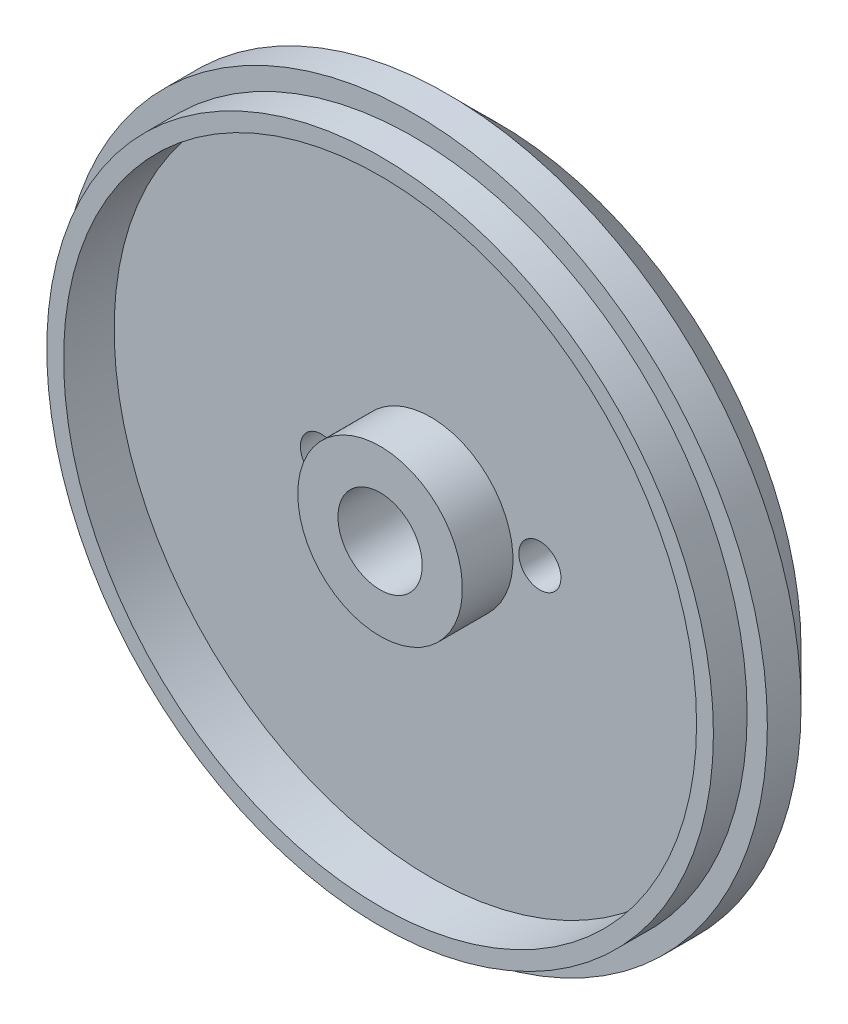
ISO-10303-21;
HEADER;
FILE_DESCRIPTION(('STEP AP214'),'2;1');
FILE_NAME('part.step','',(''),(''),'','','');
FILE_SCHEMA(('AUTOMOTIVE_DESIGN { 1 0 10303 214 1 1 1 1 }'));
ENDSEC;
DATA;
#1=APPLICATION_CONTEXT('core data for automotive mechanical design processes');
#2=APPLICATION_PROTOCOL_DEFINITION('international standard','automotive_design',2000,#1);
#3=PRODUCT_CONTEXT('',#1,'mechanical');
#4=PRODUCT('Part','Part','',(#3));
#5=PRODUCT_RELATED_PRODUCT_CATEGORY('part','',(#4));
#6=PRODUCT_DEFINITION_FORMATION('','',#4);
#7=PRODUCT_DEFINITION_CONTEXT('part definition',#1,'design');
#8=PRODUCT_DEFINITION('design','',#6,#7);
#9=PRODUCT_DEFINITION_SHAPE('','',#8);
#10=(LENGTH_UNIT() NAMED_UNIT(*) SI_UNIT(.MILLI.,.METRE.));
#11=(NAMED_UNIT(*) PLANE_ANGLE_UNIT() SI_UNIT($,.RADIAN.));
#12=(NAMED_UNIT(*) SI_UNIT($,.STERADIAN.) SOLID_ANGLE_UNIT());
#13=UNCERTAINTY_MEASURE_WITH_UNIT(LENGTH_MEASURE(1.E-05),#10,'distance_accuracy_value','');
#14=(GEOMETRIC_REPRESENTATION_CONTEXT(3) GLOBAL_UNCERTAINTY_ASSIGNED_CONTEXT((#13)) GLOBAL_UNIT_ASSIGNED_CONTEXT((#10,
#11,#12)) REPRESENTATION_CONTEXT('',''));
#15=CARTESIAN_POINT('',(0.,0.,0.));
#16=DIRECTION('',(0.,0.,1.));
#17=DIRECTION('',(1.,0.,0.));
#18=AXIS2_PLACEMENT_3D('',#15,#16,#17);
#19=CARTESIAN_POINT('',(19.78,0.,-38.5135189018775));
#20=DIRECTION('',(0.,0.,1.));
#21=DIRECTION('',(1.,0.,0.));
#22=AXIS2_PLACEMENT_3D('',#19,#20,#21);
#23=PLANE('',#22);
#24=CARTESIAN_POINT('',(-1.3443984758073E-13,0.,-38.5135189018774));
#25=DIRECTION('',(0.,0.,1.));
#26=DIRECTION('',(1.,0.,0.));
#27=AXIS2_PLACEMENT_3D('',#24,#25,#26);
#28=CIRCLE('',#27,19.7800000000001);
#29=CARTESIAN_POINT('',(19.78,0.,-38.5135189018775));
#30=VERTEX_POINT('',#29);
#31=EDGE_CURVE('E60',#30,#30,#28,.T.);
#32=ORIENTED_EDGE('',*,*,#31,.F.);
#33=EDGE_LOOP('',(#32));
#34=FACE_BOUND('',#33,.T.);
#35=CARTESIAN_POINT('',(-1.3443984758073E-13,0.,-38.5135189018774));
#36=DIRECTION('',(0.,0.,1.));
#37=DIRECTION('',(1.,0.,0.));
#38=AXIS2_PLACEMENT_3D('',#35,#36,#37);
#39=CIRCLE('',#38,20.9799999999991);
#40=CARTESIAN_POINT('',(20.979999999999,0.,-38.5135189018775));
#41=VERTEX_POINT('',#40);
#42=EDGE_CURVE('E18',#41,#41,#39,.F.);
#43=ORIENTED_EDGE('',*,*,#42,.F.);
#44=EDGE_LOOP('',(#43));
#45=FACE_BOUND('',#44,.T.);
#46=ADVANCED_FACE('F15',(#34,#45),#23,.T.);
#47=CARTESIAN_POINT('',(0.,0.,0.));
#48=DIRECTION('',(0.,0.,1.));
#49=DIRECTION('',(1.,0.,0.));
#50=AXIS2_PLACEMENT_3D('',#47,#48,#49);
#51=CYLINDRICAL_SURFACE('',#50,20.9799999999991);
#52=ORIENTED_EDGE('',*,*,#42,.T.);
#53=EDGE_LOOP('',(#52));
#54=FACE_BOUND('',#53,.T.);
#55=CARTESIAN_POINT('',(-1.41421284302898E-13,0.,-40.5135189018775));
#56=DIRECTION('',(0.,0.,1.));
#57=DIRECTION('',(1.,0.,0.));
#58=AXIS2_PLACEMENT_3D('',#55,#56,#57);
#59=CIRCLE('',#58,20.9799999999991);
#60=CARTESIAN_POINT('',(20.979999999999,0.,-40.5135189018775));
#61=VERTEX_POINT('',#60);
#62=EDGE_CURVE('E30',#61,#61,#59,.F.);
#63=ORIENTED_EDGE('',*,*,#62,.F.);
#64=EDGE_LOOP('',(#63));
#65=FACE_BOUND('',#64,.T.);
#66=ADVANCED_FACE('F68',(#54,#65),#51,.T.);
#67=CARTESIAN_POINT('',(0.,0.,0.));
#68=DIRECTION('',(0.,0.,1.));
#69=DIRECTION('',(1.,0.,0.));
#70=AXIS2_PLACEMENT_3D('',#67,#68,#69);
#71=CYLINDRICAL_SURFACE('',#70,19.7800000000001);
#72=ORIENTED_EDGE('',*,*,#31,.T.);
#73=EDGE_LOOP('',(#72));
#74=FACE_BOUND('',#73,.T.);
#75=CARTESIAN_POINT('',(-1.27458410858563E-13,0.,-36.5135189018774));
#76=DIRECTION('',(0.,0.,1.));
#77=DIRECTION('',(1.,0.,0.));
#78=AXIS2_PLACEMENT_3D('',#75,#76,#77);
#79=CIRCLE('',#78,19.7800000000001);
#80=CARTESIAN_POINT('',(19.78,0.,-36.5135189018774));
#81=VERTEX_POINT('',#80);
#82=EDGE_CURVE('E58',#81,#81,#79,.T.);
#83=ORIENTED_EDGE('',*,*,#82,.F.);
#84=EDGE_LOOP('',(#83));
#85=FACE_BOUND('',#84,.T.);
#86=ADVANCED_FACE('F77',(#74,#85),#71,.T.);
#87=CARTESIAN_POINT('',(-1.42247325030098E-13,0.,-40.5135189018775));
#88=DIRECTION('',(0.,0.,1.));
#89=DIRECTION('',(1.,0.,0.));
#90=AXIS2_PLACEMENT_3D('',#87,#88,#89);
#91=CONICAL_SURFACE('',#90,20.9799999999991,0.785398163397446);
#92=ORIENTED_EDGE('',*,*,#62,.T.);
#93=EDGE_LOOP('',(#92));
#94=FACE_BOUND('',#93,.T.);
#95=CARTESIAN_POINT('',(-1.52665588041208E-13,0.,-43.5135189018775));
#96=DIRECTION('',(0.,0.,1.));
#97=DIRECTION('',(1.,0.,0.));
#98=AXIS2_PLACEMENT_3D('',#95,#96,#97);
#99=CIRCLE('',#98,17.9799999999991);
#100=CARTESIAN_POINT('',(17.979999999999,0.,-43.5135189018775));
#101=VERTEX_POINT('',#100);
#102=EDGE_CURVE('E55',#101,#101,#99,.F.);
#103=ORIENTED_EDGE('',*,*,#102,.F.);
#104=EDGE_LOOP('',(#103));
#105=FACE_BOUND('',#104,.T.);
#106=ADVANCED_FACE('F117',(#94,#105),#91,.T.);
#107=CARTESIAN_POINT('',(-2.21328687789345E-13,0.,-63.4049112230954));
#108=DIRECTION('',(0.,0.,1.));
#109=DIRECTION('',(1.,0.,0.));
#110=AXIS2_PLACEMENT_3D('',#107,#108,#109);
#111=CYLINDRICAL_SURFACE('',#110,2.50000000000027);
#112=CARTESIAN_POINT('',(-1.27458410858563E-13,0.,-36.5135189018775));
#113=DIRECTION('',(0.,0.,1.));
#114=DIRECTION('',(1.,0.,0.));
#115=AXIS2_PLACEMENT_3D('',#112,#113,#114);
#116=CIRCLE('',#115,2.50000000000027);
#117=CARTESIAN_POINT('',(2.50000000000014,0.,-36.5135189018775));
#118=VERTEX_POINT('',#117);
#119=EDGE_CURVE('E49',#118,#118,#116,.F.);
#120=ORIENTED_EDGE('',*,*,#119,.F.);
#121=EDGE_LOOP('',(#120));
#122=FACE_BOUND('',#121,.T.);
#123=CARTESIAN_POINT('',(-1.51893439386149E-13,0.,-43.5135189018775));
#124=DIRECTION('',(0.,0.,1.));
#125=DIRECTION('',(1.,0.,0.));
#126=AXIS2_PLACEMENT_3D('',#123,#124,#125);
#127=CIRCLE('',#126,2.50000000000027);
#128=CARTESIAN_POINT('',(2.50000000000012,0.,-43.5135189018775));
#129=VERTEX_POINT('',#128);
#130=EDGE_CURVE('E52',#129,#129,#127,.T.);
#131=ORIENTED_EDGE('',*,*,#130,.F.);
#132=EDGE_LOOP('',(#131));
#133=FACE_BOUND('',#132,.T.);
#134=ADVANCED_FACE('F113',(#122,#133),#111,.F.);
#135=CARTESIAN_POINT('',(-1.16986255775312E-13,0.,-36.5135189018774));
#136=DIRECTION('',(0.,0.,1.));
#137=DIRECTION('',(1.,0.,0.));
#138=AXIS2_PLACEMENT_3D('',#135,#136,#137);
#139=PLANE('',#138);
#140=ORIENTED_EDGE('',*,*,#82,.T.);
#141=EDGE_LOOP('',(#140));
#142=FACE_BOUND('',#141,.T.);
#143=CARTESIAN_POINT('',(-1.27458410858563E-13,0.,-36.5135189018774));
#144=DIRECTION('',(0.,0.,1.));
#145=DIRECTION('',(1.,0.,0.));
#146=AXIS2_PLACEMENT_3D('',#143,#144,#145);
#147=CIRCLE('',#146,18.7800000000002);
#148=CARTESIAN_POINT('',(18.78,0.,-36.5135189018774));
#149=VERTEX_POINT('',#148);
#150=EDGE_CURVE('E46',#149,#149,#147,.F.);
#151=ORIENTED_EDGE('',*,*,#150,.T.);
#152=EDGE_LOOP('',(#151));
#153=FACE_BOUND('',#152,.T.);
#154=ADVANCED_FACE('F109',(#142,#153),#139,.T.);
#155=CARTESIAN_POINT('',(2.5000000000001,0.,-43.5135189018775));
#156=DIRECTION('',(0.,0.,-1.));
#157=DIRECTION('',(-1.,0.,0.));
#158=AXIS2_PLACEMENT_3D('',#155,#156,#157);
#159=PLANE('',#158);
#160=ORIENTED_EDGE('',*,*,#130,.T.);
#161=EDGE_LOOP('',(#160));
#162=FACE_BOUND('',#161,.T.);
#163=CARTESIAN_POINT('',(-6.48182468167782,-0.485745608311755,-43.5135189018775));
#164=DIRECTION('',(0.,0.,-1.));
#165=DIRECTION('',(-1.,0.,0.));
#166=AXIS2_PLACEMENT_3D('',#163,#164,#165);
#167=CIRCLE('',#166,1.24999999999999);
#168=CARTESIAN_POINT('',(-7.73182468167782,-0.485745608311755,-43.5135189018775));
#169=VERTEX_POINT('',#168);
#170=EDGE_CURVE('E43',#169,#169,#167,.F.);
#171=ORIENTED_EDGE('',*,*,#170,.T.);
#172=EDGE_LOOP('',(#171));
#173=FACE_BOUND('',#172,.T.);
#174=CARTESIAN_POINT('',(6.48182468167752,0.485745608311708,-43.5135189018775));
#175=DIRECTION('',(0.,0.,-1.));
#176=DIRECTION('',(-1.,0.,0.));
#177=AXIS2_PLACEMENT_3D('',#174,#175,#176);
#178=CIRCLE('',#177,1.24999999999999);
#179=CARTESIAN_POINT('',(5.23182468167753,0.485745608311708,-43.5135189018775));
#180=VERTEX_POINT('',#179);
#181=EDGE_CURVE('E40',#180,#180,#178,.F.);
#182=ORIENTED_EDGE('',*,*,#181,.T.);
#183=EDGE_LOOP('',(#182));
#184=FACE_BOUND('',#183,.T.);
#185=ORIENTED_EDGE('',*,*,#102,.T.);
#186=EDGE_LOOP('',(#185));
#187=FACE_BOUND('',#186,.T.);
#188=ADVANCED_FACE('F105',(#162,#173,#184,#187),#159,.T.);
#189=CARTESIAN_POINT('',(2.5000000000001,0.,-36.5135189018775));
#190=DIRECTION('',(0.,0.,1.));
#191=DIRECTION('',(1.,0.,0.));
#192=AXIS2_PLACEMENT_3D('',#189,#190,#191);
#193=PLANE('',#192);
#194=CARTESIAN_POINT('',(-1.27458410858563E-13,0.,-36.5135189018775));
#195=DIRECTION('',(0.,0.,-1.));
#196=DIRECTION('',(-1.,0.,0.));
#197=AXIS2_PLACEMENT_3D('',#194,#195,#196);
#198=CIRCLE('',#197,4.88430261185815);
#199=CARTESIAN_POINT('',(-4.88430261185827,0.,-36.5135189018775));
#200=VERTEX_POINT('',#199);
#201=EDGE_CURVE('E37',#200,#200,#198,.T.);
#202=ORIENTED_EDGE('',*,*,#201,.F.);
#203=EDGE_LOOP('',(#202));
#204=FACE_BOUND('',#203,.T.);
#205=ORIENTED_EDGE('',*,*,#119,.T.);
#206=EDGE_LOOP('',(#205));
#207=FACE_BOUND('',#206,.T.);
#208=ADVANCED_FACE('F101',(#204,#207),#193,.T.);
#209=CARTESIAN_POINT('',(0.,0.,0.));
#210=DIRECTION('',(0.,0.,1.));
#211=DIRECTION('',(1.,0.,0.));
#212=AXIS2_PLACEMENT_3D('',#209,#210,#211);
#213=CYLINDRICAL_SURFACE('',#212,18.7800000000002);
#214=ORIENTED_EDGE('',*,*,#150,.F.);
#215=EDGE_LOOP('',(#214));
#216=FACE_BOUND('',#215,.T.);
#217=CARTESIAN_POINT('',(-1.37930565941814E-13,0.,-39.5135189018774));
#218=DIRECTION('',(0.,0.,1.));
#219=DIRECTION('',(1.,0.,0.));
#220=AXIS2_PLACEMENT_3D('',#217,#218,#219);
#221=CIRCLE('',#220,18.7800000000002);
#222=CARTESIAN_POINT('',(18.78,0.,-39.5135189018775));
#223=VERTEX_POINT('',#222);
#224=EDGE_CURVE('E34',#223,#223,#221,.F.);
#225=ORIENTED_EDGE('',*,*,#224,.T.);
#226=EDGE_LOOP('',(#225));
#227=FACE_BOUND('',#226,.T.);
#228=ADVANCED_FACE('F97',(#216,#227),#213,.F.);
#229=CARTESIAN_POINT('',(-6.48182468167782,-0.485745608311755,-43.5135189018775));
#230=DIRECTION('',(0.,0.,-1.));
#231=DIRECTION('',(-1.,0.,0.));
#232=AXIS2_PLACEMENT_3D('',#229,#230,#231);
#233=CYLINDRICAL_SURFACE('',#232,1.24999999999999);
#234=CARTESIAN_POINT('',(-6.48182468167782,-0.485745608311755,-39.5135189018774));
#235=DIRECTION('',(0.,0.,-1.));
#236=DIRECTION('',(-1.,0.,0.));
#237=AXIS2_PLACEMENT_3D('',#234,#235,#236);
#238=CIRCLE('',#237,1.24999999999999);
#239=CARTESIAN_POINT('',(-7.73182468167782,-0.485745608311755,-39.5135189018774));
#240=VERTEX_POINT('',#239);
#241=EDGE_CURVE('E27',#240,#240,#238,.F.);
#242=ORIENTED_EDGE('',*,*,#241,.T.);
#243=EDGE_LOOP('',(#242));
#244=FACE_BOUND('',#243,.T.);
#245=ORIENTED_EDGE('',*,*,#170,.F.);
#246=EDGE_LOOP('',(#245));
#247=FACE_BOUND('',#246,.T.);
#248=ADVANCED_FACE('F93',(#244,#247),#233,.F.);
#249=CARTESIAN_POINT('',(6.48182468167752,0.485745608311708,-43.5135189018775));
#250=DIRECTION('',(0.,0.,-1.));
#251=DIRECTION('',(-1.,0.,0.));
#252=AXIS2_PLACEMENT_3D('',#249,#250,#251);
#253=CYLINDRICAL_SURFACE('',#252,1.24999999999999);
#254=CARTESIAN_POINT('',(6.48182468167752,0.485745608311708,-39.5135189018775));
#255=DIRECTION('',(0.,0.,-1.));
#256=DIRECTION('',(-1.,0.,0.));
#257=AXIS2_PLACEMENT_3D('',#254,#255,#256);
#258=CIRCLE('',#257,1.24999999999999);
#259=CARTESIAN_POINT('',(5.23182468167753,0.485745608311708,-39.5135189018775));
#260=VERTEX_POINT('',#259);
#261=EDGE_CURVE('E22',#260,#260,#258,.F.);
#262=ORIENTED_EDGE('',*,*,#261,.T.);
#263=EDGE_LOOP('',(#262));
#264=FACE_BOUND('',#263,.T.);
#265=ORIENTED_EDGE('',*,*,#181,.F.);
#266=EDGE_LOOP('',(#265));
#267=FACE_BOUND('',#266,.T.);
#268=ADVANCED_FACE('F86',(#264,#267),#253,.F.);
#269=CARTESIAN_POINT('',(-1.27458410858563E-13,0.,-22.6986249090293));
#270=DIRECTION('',(0.,0.,-1.));
#271=DIRECTION('',(-1.,0.,0.));
#272=AXIS2_PLACEMENT_3D('',#269,#270,#271);
#273=CYLINDRICAL_SURFACE('',#272,4.88430261185815);
#274=ORIENTED_EDGE('',*,*,#201,.T.);
#275=EDGE_LOOP('',(#274));
#276=FACE_BOUND('',#275,.T.);
#277=CARTESIAN_POINT('',(-1.27458410858563E-13,0.,-39.5135189018775));
#278=DIRECTION('',(0.,0.,-1.));
#279=DIRECTION('',(-1.,0.,0.));
#280=AXIS2_PLACEMENT_3D('',#277,#278,#279);
#281=CIRCLE('',#280,4.88430261185815);
#282=CARTESIAN_POINT('',(-4.88430261185827,0.,-39.5135189018775));
#283=VERTEX_POINT('',#282);
#284=EDGE_CURVE('E10',#283,#283,#281,.F.);
#285=ORIENTED_EDGE('',*,*,#284,.T.);
#286=EDGE_LOOP('',(#285));
#287=FACE_BOUND('',#286,.T.);
#288=ADVANCED_FACE('F80',(#276,#287),#273,.T.);
#289=CARTESIAN_POINT('',(-1.37930565941814E-13,0.,-39.5135189018774));
#290=DIRECTION('',(0.,0.,-1.));
#291=DIRECTION('',(-1.,0.,0.));
#292=AXIS2_PLACEMENT_3D('',#289,#290,#291);
#293=PLANE('',#292);
#294=ORIENTED_EDGE('',*,*,#284,.F.);
#295=EDGE_LOOP('',(#294));
#296=FACE_BOUND('',#295,.T.);
#297=ORIENTED_EDGE('',*,*,#261,.F.);
#298=EDGE_LOOP('',(#297));
#299=FACE_BOUND('',#298,.T.);
#300=ORIENTED_EDGE('',*,*,#241,.F.);
#301=EDGE_LOOP('',(#300));
#302=FACE_BOUND('',#301,.T.);
#303=ORIENTED_EDGE('',*,*,#224,.F.);
#304=EDGE_LOOP('',(#303));
#305=FACE_BOUND('',#304,.T.);
#306=ADVANCED_FACE('F78',(#296,#299,#302,#305),#293,.F.);
#307=CLOSED_SHELL('',(#46,#66,#86,#106,#134,#154,#188,#208,#228,#248,#268,#288,#306));
#308=MANIFOLD_SOLID_BREP('B1',#307);
#309=ADVANCED_BREP_SHAPE_REPRESENTATION('',(#18,#308),#14);
#310=SHAPE_DEFINITION_REPRESENTATION(#9,#309);
ENDSEC;
END-ISO-10303-21;
